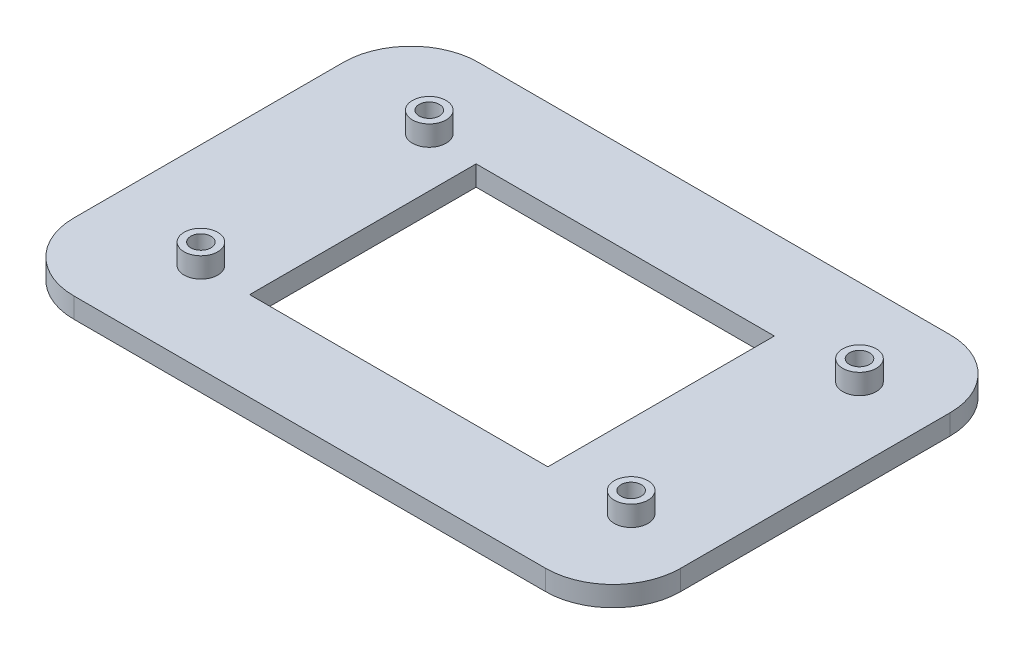
ISO-10303-21;
HEADER;
FILE_DESCRIPTION(('STEP AP214'),'2;1');
FILE_NAME('part.step','',(''),(''),'','','');
FILE_SCHEMA(('AUTOMOTIVE_DESIGN { 1 0 10303 214 1 1 1 1 }'));
ENDSEC;
DATA;
#1=APPLICATION_CONTEXT('core data for automotive mechanical design processes');
#2=APPLICATION_PROTOCOL_DEFINITION('international standard','automotive_design',2000,#1);
#3=PRODUCT_CONTEXT('',#1,'mechanical');
#4=PRODUCT('Part','Part','',(#3));
#5=PRODUCT_RELATED_PRODUCT_CATEGORY('part','',(#4));
#6=PRODUCT_DEFINITION_FORMATION('','',#4);
#7=PRODUCT_DEFINITION_CONTEXT('part definition',#1,'design');
#8=PRODUCT_DEFINITION('design','',#6,#7);
#9=PRODUCT_DEFINITION_SHAPE('','',#8);
#10=(LENGTH_UNIT() NAMED_UNIT(*) SI_UNIT(.MILLI.,.METRE.));
#11=(NAMED_UNIT(*) PLANE_ANGLE_UNIT() SI_UNIT($,.RADIAN.));
#12=(NAMED_UNIT(*) SI_UNIT($,.STERADIAN.) SOLID_ANGLE_UNIT());
#13=UNCERTAINTY_MEASURE_WITH_UNIT(LENGTH_MEASURE(1.E-05),#10,'distance_accuracy_value','');
#14=(GEOMETRIC_REPRESENTATION_CONTEXT(3) GLOBAL_UNCERTAINTY_ASSIGNED_CONTEXT((#13)) GLOBAL_UNIT_ASSIGNED_CONTEXT((#10,
#11,#12)) REPRESENTATION_CONTEXT('',''));
#15=CARTESIAN_POINT('',(0.,0.,0.));
#16=DIRECTION('',(0.,0.,1.));
#17=DIRECTION('',(1.,0.,0.));
#18=AXIS2_PLACEMENT_3D('',#15,#16,#17);
#19=CARTESIAN_POINT('',(-60.8536585365854,3.,-27.6829268292683));
#20=DIRECTION('',(1.,0.,0.));
#21=DIRECTION('',(0.,0.,-1.));
#22=AXIS2_PLACEMENT_3D('',#19,#20,#21);
#23=PLANE('',#22);
#24=DIRECTION('',(0.,0.,1.));
#25=VECTOR('',#24,1.);
#26=CARTESIAN_POINT('',(-60.8536585365854,0.,-27.6829268292683));
#27=LINE('',#26,#25);
#28=CARTESIAN_POINT('',(-60.8536585365854,0.,-17.6829268292683));
#29=VERTEX_POINT('',#28);
#30=CARTESIAN_POINT('',(-60.8536585365854,0.,22.3170731707317));
#31=VERTEX_POINT('',#30);
#32=EDGE_CURVE('E167',#29,#31,#27,.T.);
#33=ORIENTED_EDGE('',*,*,#32,.T.);
#34=DIRECTION('',(0.,-1.,0.));
#35=VECTOR('',#34,1.);
#36=CARTESIAN_POINT('',(-60.8536585365854,3.,22.3170731707317));
#37=LINE('',#36,#35);
#38=CARTESIAN_POINT('',(-60.8536585365854,3.,22.3170731707317));
#39=VERTEX_POINT('',#38);
#40=EDGE_CURVE('E11',#31,#39,#37,.F.);
#41=ORIENTED_EDGE('',*,*,#40,.T.);
#42=DIRECTION('',(0.,0.,1.));
#43=VECTOR('',#42,1.);
#44=CARTESIAN_POINT('',(-60.8536585365854,3.,-27.6829268292683));
#45=LINE('',#44,#43);
#46=CARTESIAN_POINT('',(-60.8536585365854,3.,-17.6829268292683));
#47=VERTEX_POINT('',#46);
#48=EDGE_CURVE('E171',#47,#39,#45,.T.);
#49=ORIENTED_EDGE('',*,*,#48,.F.);
#50=DIRECTION('',(0.,-1.,0.));
#51=VECTOR('',#50,1.);
#52=CARTESIAN_POINT('',(-60.8536585365854,3.,-17.6829268292683));
#53=LINE('',#52,#51);
#54=EDGE_CURVE('E41',#47,#29,#53,.T.);
#55=ORIENTED_EDGE('',*,*,#54,.T.);
#56=EDGE_LOOP('',(#33,#41,#49,#55));
#57=FACE_BOUND('',#56,.T.);
#58=ADVANCED_FACE('F33',(#57),#23,.F.);
#59=CARTESIAN_POINT('',(-60.8536585365854,3.,32.3170731707317));
#60=DIRECTION('',(0.,0.,-1.));
#61=DIRECTION('',(-1.,0.,0.));
#62=AXIS2_PLACEMENT_3D('',#59,#60,#61);
#63=PLANE('',#62);
#64=DIRECTION('',(1.,0.,0.));
#65=VECTOR('',#64,1.);
#66=CARTESIAN_POINT('',(-60.8536585365854,0.,32.3170731707317));
#67=LINE('',#66,#65);
#68=CARTESIAN_POINT('',(-50.8536585365854,0.,32.3170731707317));
#69=VERTEX_POINT('',#68);
#70=CARTESIAN_POINT('',(19.1463414634146,0.,32.3170731707317));
#71=VERTEX_POINT('',#70);
#72=EDGE_CURVE('E185',#69,#71,#67,.T.);
#73=ORIENTED_EDGE('',*,*,#72,.T.);
#74=DIRECTION('',(0.,-1.,0.));
#75=VECTOR('',#74,1.);
#76=CARTESIAN_POINT('',(19.1463414634146,3.,32.3170731707317));
#77=LINE('',#76,#75);
#78=CARTESIAN_POINT('',(19.1463414634146,3.,32.3170731707317));
#79=VERTEX_POINT('',#78);
#80=EDGE_CURVE('E48',#71,#79,#77,.F.);
#81=ORIENTED_EDGE('',*,*,#80,.T.);
#82=DIRECTION('',(1.,0.,0.));
#83=VECTOR('',#82,1.);
#84=CARTESIAN_POINT('',(-60.8536585365854,3.,32.3170731707317));
#85=LINE('',#84,#83);
#86=CARTESIAN_POINT('',(-50.8536585365854,3.,32.3170731707317));
#87=VERTEX_POINT('',#86);
#88=EDGE_CURVE('E173',#87,#79,#85,.T.);
#89=ORIENTED_EDGE('',*,*,#88,.F.);
#90=DIRECTION('',(0.,-1.,0.));
#91=VECTOR('',#90,1.);
#92=CARTESIAN_POINT('',(-50.8536585365854,3.,32.3170731707317));
#93=LINE('',#92,#91);
#94=EDGE_CURVE('E216',#87,#69,#93,.T.);
#95=ORIENTED_EDGE('',*,*,#94,.T.);
#96=EDGE_LOOP('',(#73,#81,#89,#95));
#97=FACE_BOUND('',#96,.T.);
#98=ADVANCED_FACE('F232',(#97),#63,.F.);
#99=CARTESIAN_POINT('',(29.1463414634146,3.,-27.6829268292683));
#100=DIRECTION('',(-1.,0.,0.));
#101=DIRECTION('',(0.,0.,1.));
#102=AXIS2_PLACEMENT_3D('',#99,#100,#101);
#103=PLANE('',#102);
#104=DIRECTION('',(0.,0.,-1.));
#105=VECTOR('',#104,1.);
#106=CARTESIAN_POINT('',(29.1463414634146,0.,-27.6829268292683));
#107=LINE('',#106,#105);
#108=CARTESIAN_POINT('',(29.1463414634146,0.,22.3170731707317));
#109=VERTEX_POINT('',#108);
#110=CARTESIAN_POINT('',(29.1463414634146,0.,-17.6829268292683));
#111=VERTEX_POINT('',#110);
#112=EDGE_CURVE('E187',#109,#111,#107,.T.);
#113=ORIENTED_EDGE('',*,*,#112,.T.);
#114=DIRECTION('',(0.,-1.,0.));
#115=VECTOR('',#114,1.);
#116=CARTESIAN_POINT('',(29.1463414634146,3.,-17.6829268292683));
#117=LINE('',#116,#115);
#118=CARTESIAN_POINT('',(29.1463414634146,3.,-17.6829268292683));
#119=VERTEX_POINT('',#118);
#120=EDGE_CURVE('E207',#111,#119,#117,.F.);
#121=ORIENTED_EDGE('',*,*,#120,.T.);
#122=DIRECTION('',(0.,0.,-1.));
#123=VECTOR('',#122,1.);
#124=CARTESIAN_POINT('',(29.1463414634146,3.,-27.6829268292683));
#125=LINE('',#124,#123);
#126=CARTESIAN_POINT('',(29.1463414634146,3.,22.3170731707317));
#127=VERTEX_POINT('',#126);
#128=EDGE_CURVE('E176',#127,#119,#125,.T.);
#129=ORIENTED_EDGE('',*,*,#128,.F.);
#130=DIRECTION('',(0.,-1.,0.));
#131=VECTOR('',#130,1.);
#132=CARTESIAN_POINT('',(29.1463414634146,3.,22.3170731707317));
#133=LINE('',#132,#131);
#134=EDGE_CURVE('E204',#127,#109,#133,.T.);
#135=ORIENTED_EDGE('',*,*,#134,.T.);
#136=EDGE_LOOP('',(#113,#121,#129,#135));
#137=FACE_BOUND('',#136,.T.);
#138=ADVANCED_FACE('F241',(#137),#103,.F.);
#139=CARTESIAN_POINT('',(-60.8536585365854,3.,-27.6829268292683));
#140=DIRECTION('',(0.,0.,1.));
#141=DIRECTION('',(1.,0.,0.));
#142=AXIS2_PLACEMENT_3D('',#139,#140,#141);
#143=PLANE('',#142);
#144=DIRECTION('',(-1.,0.,0.));
#145=VECTOR('',#144,1.);
#146=CARTESIAN_POINT('',(-60.8536585365854,3.,-27.6829268292683));
#147=LINE('',#146,#145);
#148=CARTESIAN_POINT('',(19.1463414634146,3.,-27.6829268292683));
#149=VERTEX_POINT('',#148);
#150=CARTESIAN_POINT('',(-50.8536585365854,3.,-27.6829268292683));
#151=VERTEX_POINT('',#150);
#152=EDGE_CURVE('E179',#149,#151,#147,.T.);
#153=ORIENTED_EDGE('',*,*,#152,.F.);
#154=DIRECTION('',(0.,-1.,0.));
#155=VECTOR('',#154,1.);
#156=CARTESIAN_POINT('',(19.1463414634146,3.,-27.6829268292683));
#157=LINE('',#156,#155);
#158=CARTESIAN_POINT('',(19.1463414634146,0.,-27.6829268292683));
#159=VERTEX_POINT('',#158);
#160=EDGE_CURVE('E193',#149,#159,#157,.T.);
#161=ORIENTED_EDGE('',*,*,#160,.T.);
#162=DIRECTION('',(-1.,0.,0.));
#163=VECTOR('',#162,1.);
#164=CARTESIAN_POINT('',(-60.8536585365854,0.,-27.6829268292683));
#165=LINE('',#164,#163);
#166=CARTESIAN_POINT('',(-50.8536585365854,0.,-27.6829268292683));
#167=VERTEX_POINT('',#166);
#168=EDGE_CURVE('E174',#159,#167,#165,.T.);
#169=ORIENTED_EDGE('',*,*,#168,.T.);
#170=DIRECTION('',(0.,-1.,0.));
#171=VECTOR('',#170,1.);
#172=CARTESIAN_POINT('',(-50.8536585365854,3.,-27.6829268292683));
#173=LINE('',#172,#171);
#174=EDGE_CURVE('E182',#167,#151,#173,.F.);
#175=ORIENTED_EDGE('',*,*,#174,.T.);
#176=EDGE_LOOP('',(#153,#161,#169,#175));
#177=FACE_BOUND('',#176,.T.);
#178=ADVANCED_FACE('F249',(#177),#143,.F.);
#179=CARTESIAN_POINT('',(0.,3.,0.));
#180=DIRECTION('',(0.,1.,0.));
#181=DIRECTION('',(0.,0.,1.));
#182=AXIS2_PLACEMENT_3D('',#179,#180,#181);
#183=PLANE('',#182);
#184=CARTESIAN_POINT('',(18.4713414634146,3.,-14.8979268292683));
#185=DIRECTION('',(0.,1.,0.));
#186=DIRECTION('',(0.,0.,1.));
#187=AXIS2_PLACEMENT_3D('',#184,#185,#186);
#188=CIRCLE('',#187,2.5);
#189=CARTESIAN_POINT('',(18.4713414634146,3.,-12.3979268292683));
#190=VERTEX_POINT('',#189);
#191=EDGE_CURVE('E538',#190,#190,#188,.T.);
#192=ORIENTED_EDGE('',*,*,#191,.F.);
#193=EDGE_LOOP('',(#192));
#194=FACE_BOUND('',#193,.T.);
#195=CARTESIAN_POINT('',(18.4713414634146,3.,18.9720731707317));
#196=DIRECTION('',(0.,1.,0.));
#197=DIRECTION('',(0.,0.,1.));
#198=AXIS2_PLACEMENT_3D('',#195,#196,#197);
#199=CIRCLE('',#198,2.5);
#200=CARTESIAN_POINT('',(18.4713414634146,3.,21.4720731707317));
#201=VERTEX_POINT('',#200);
#202=EDGE_CURVE('E532',#201,#201,#199,.T.);
#203=ORIENTED_EDGE('',*,*,#202,.F.);
#204=EDGE_LOOP('',(#203));
#205=FACE_BOUND('',#204,.T.);
#206=CARTESIAN_POINT('',(-45.3386585365854,3.,18.9720731707317));
#207=DIRECTION('',(0.,1.,0.));
#208=DIRECTION('',(0.,0.,1.));
#209=AXIS2_PLACEMENT_3D('',#206,#207,#208);
#210=CIRCLE('',#209,2.5);
#211=CARTESIAN_POINT('',(-45.3386585365854,3.,21.4720731707317));
#212=VERTEX_POINT('',#211);
#213=EDGE_CURVE('E526',#212,#212,#210,.T.);
#214=ORIENTED_EDGE('',*,*,#213,.F.);
#215=EDGE_LOOP('',(#214));
#216=FACE_BOUND('',#215,.T.);
#217=CARTESIAN_POINT('',(-45.3386585365854,3.,-14.8979268292683));
#218=DIRECTION('',(0.,1.,0.));
#219=DIRECTION('',(0.,0.,1.));
#220=AXIS2_PLACEMENT_3D('',#217,#218,#219);
#221=CIRCLE('',#220,2.5);
#222=CARTESIAN_POINT('',(-45.3386585365854,3.,-12.3979268292683));
#223=VERTEX_POINT('',#222);
#224=EDGE_CURVE('E517',#223,#223,#221,.T.);
#225=ORIENTED_EDGE('',*,*,#224,.F.);
#226=EDGE_LOOP('',(#225));
#227=FACE_BOUND('',#226,.T.);
#228=DIRECTION('',(0.,0.,1.));
#229=VECTOR('',#228,1.);
#230=CARTESIAN_POINT('',(-37.9686585365854,3.,-14.4779268292683));
#231=LINE('',#230,#229);
#232=CARTESIAN_POINT('',(-37.9686585365854,3.,-14.4779268292683));
#233=VERTEX_POINT('',#232);
#234=CARTESIAN_POINT('',(-37.9686585365854,3.,19.1120731707317));
#235=VERTEX_POINT('',#234);
#236=EDGE_CURVE('E130',#233,#235,#231,.T.);
#237=ORIENTED_EDGE('',*,*,#236,.F.);
#238=DIRECTION('',(-1.,0.,0.));
#239=VECTOR('',#238,1.);
#240=CARTESIAN_POINT('',(-37.9686585365854,3.,-14.4779268292683));
#241=LINE('',#240,#239);
#242=CARTESIAN_POINT('',(6.26134146341462,3.,-14.4779268292683));
#243=VERTEX_POINT('',#242);
#244=EDGE_CURVE('E148',#243,#233,#241,.T.);
#245=ORIENTED_EDGE('',*,*,#244,.F.);
#246=DIRECTION('',(0.,0.,-1.));
#247=VECTOR('',#246,1.);
#248=CARTESIAN_POINT('',(6.26134146341462,3.,-14.4779268292683));
#249=LINE('',#248,#247);
#250=CARTESIAN_POINT('',(6.26134146341463,3.,19.1120731707317));
#251=VERTEX_POINT('',#250);
#252=EDGE_CURVE('E151',#251,#243,#249,.T.);
#253=ORIENTED_EDGE('',*,*,#252,.F.);
#254=DIRECTION('',(1.,0.,0.));
#255=VECTOR('',#254,1.);
#256=CARTESIAN_POINT('',(-37.9686585365854,3.,19.1120731707317));
#257=LINE('',#256,#255);
#258=EDGE_CURVE('E160',#235,#251,#257,.T.);
#259=ORIENTED_EDGE('',*,*,#258,.F.);
#260=EDGE_LOOP('',(#237,#245,#253,#259));
#261=FACE_BOUND('',#260,.T.);
#262=ORIENTED_EDGE('',*,*,#128,.T.);
#263=CARTESIAN_POINT('',(19.1463414634146,3.,-17.6829268292683));
#264=DIRECTION('',(0.,1.,0.));
#265=DIRECTION('',(0.,0.,1.));
#266=AXIS2_PLACEMENT_3D('',#263,#264,#265);
#267=CIRCLE('',#266,10.);
#268=EDGE_CURVE('E214',#119,#149,#267,.T.);
#269=ORIENTED_EDGE('',*,*,#268,.T.);
#270=ORIENTED_EDGE('',*,*,#152,.T.);
#271=CARTESIAN_POINT('',(-50.8536585365854,3.,-17.6829268292683));
#272=DIRECTION('',(0.,1.,0.));
#273=DIRECTION('',(0.,0.,1.));
#274=AXIS2_PLACEMENT_3D('',#271,#272,#273);
#275=CIRCLE('',#274,10.);
#276=EDGE_CURVE('E209',#151,#47,#275,.T.);
#277=ORIENTED_EDGE('',*,*,#276,.T.);
#278=ORIENTED_EDGE('',*,*,#48,.T.);
#279=CARTESIAN_POINT('',(-50.8536585365854,3.,22.3170731707317));
#280=DIRECTION('',(0.,1.,0.));
#281=DIRECTION('',(0.,0.,1.));
#282=AXIS2_PLACEMENT_3D('',#279,#280,#281);
#283=CIRCLE('',#282,10.);
#284=EDGE_CURVE('E55',#39,#87,#283,.T.);
#285=ORIENTED_EDGE('',*,*,#284,.T.);
#286=ORIENTED_EDGE('',*,*,#88,.T.);
#287=CARTESIAN_POINT('',(19.1463414634146,3.,22.3170731707317));
#288=DIRECTION('',(0.,1.,0.));
#289=DIRECTION('',(0.,0.,1.));
#290=AXIS2_PLACEMENT_3D('',#287,#288,#289);
#291=CIRCLE('',#290,10.);
#292=EDGE_CURVE('E212',#79,#127,#291,.T.);
#293=ORIENTED_EDGE('',*,*,#292,.T.);
#294=EDGE_LOOP('',(#262,#269,#270,#277,#278,#285,#286,#293));
#295=FACE_BOUND('',#294,.T.);
#296=ADVANCED_FACE('F234',(#194,#205,#216,#227,#261,#295),#183,.T.);
#297=CARTESIAN_POINT('',(0.,0.,0.));
#298=DIRECTION('',(0.,1.,0.));
#299=DIRECTION('',(0.,0.,1.));
#300=AXIS2_PLACEMENT_3D('',#297,#298,#299);
#301=PLANE('',#300);
#302=CARTESIAN_POINT('',(18.4713414634146,0.,18.9720731707317));
#303=DIRECTION('',(0.,1.,0.));
#304=DIRECTION('',(0.,0.,1.));
#305=AXIS2_PLACEMENT_3D('',#302,#303,#304);
#306=CIRCLE('',#305,1.5);
#307=CARTESIAN_POINT('',(18.4713414634146,0.,20.4720731707317));
#308=VERTEX_POINT('',#307);
#309=EDGE_CURVE('E154',#308,#308,#306,.T.);
#310=ORIENTED_EDGE('',*,*,#309,.T.);
#311=EDGE_LOOP('',(#310));
#312=FACE_BOUND('',#311,.T.);
#313=CARTESIAN_POINT('',(18.4713414634146,0.,-14.8979268292683));
#314=DIRECTION('',(0.,1.,0.));
#315=DIRECTION('',(0.,0.,1.));
#316=AXIS2_PLACEMENT_3D('',#313,#314,#315);
#317=CIRCLE('',#316,1.5);
#318=CARTESIAN_POINT('',(18.4713414634146,0.,-13.3979268292683));
#319=VERTEX_POINT('',#318);
#320=EDGE_CURVE('E507',#319,#319,#317,.T.);
#321=ORIENTED_EDGE('',*,*,#320,.T.);
#322=EDGE_LOOP('',(#321));
#323=FACE_BOUND('',#322,.T.);
#324=CARTESIAN_POINT('',(-45.3386585365854,0.,18.9720731707317));
#325=DIRECTION('',(0.,1.,0.));
#326=DIRECTION('',(0.,0.,1.));
#327=AXIS2_PLACEMENT_3D('',#324,#325,#326);
#328=CIRCLE('',#327,1.5);
#329=CARTESIAN_POINT('',(-45.3386585365854,0.,20.4720731707317));
#330=VERTEX_POINT('',#329);
#331=EDGE_CURVE('E511',#330,#330,#328,.T.);
#332=ORIENTED_EDGE('',*,*,#331,.T.);
#333=EDGE_LOOP('',(#332));
#334=FACE_BOUND('',#333,.T.);
#335=CARTESIAN_POINT('',(-45.3386585365854,0.,-14.8979268292683));
#336=DIRECTION('',(0.,1.,0.));
#337=DIRECTION('',(0.,0.,1.));
#338=AXIS2_PLACEMENT_3D('',#335,#336,#337);
#339=CIRCLE('',#338,1.5);
#340=CARTESIAN_POINT('',(-45.3386585365854,0.,-13.3979268292683));
#341=VERTEX_POINT('',#340);
#342=EDGE_CURVE('E161',#341,#341,#339,.T.);
#343=ORIENTED_EDGE('',*,*,#342,.T.);
#344=EDGE_LOOP('',(#343));
#345=FACE_BOUND('',#344,.T.);
#346=DIRECTION('',(-1.,0.,0.));
#347=VECTOR('',#346,1.);
#348=CARTESIAN_POINT('',(-37.9686585365854,0.,-14.4779268292683));
#349=LINE('',#348,#347);
#350=CARTESIAN_POINT('',(6.26134146341462,0.,-14.4779268292683));
#351=VERTEX_POINT('',#350);
#352=CARTESIAN_POINT('',(-37.9686585365854,0.,-14.4779268292683));
#353=VERTEX_POINT('',#352);
#354=EDGE_CURVE('E135',#351,#353,#349,.T.);
#355=ORIENTED_EDGE('',*,*,#354,.T.);
#356=DIRECTION('',(0.,0.,1.));
#357=VECTOR('',#356,1.);
#358=CARTESIAN_POINT('',(-37.9686585365854,0.,-14.4779268292683));
#359=LINE('',#358,#357);
#360=CARTESIAN_POINT('',(-37.9686585365854,0.,19.1120731707317));
#361=VERTEX_POINT('',#360);
#362=EDGE_CURVE('E127',#353,#361,#359,.T.);
#363=ORIENTED_EDGE('',*,*,#362,.T.);
#364=DIRECTION('',(1.,0.,0.));
#365=VECTOR('',#364,1.);
#366=CARTESIAN_POINT('',(-37.9686585365854,0.,19.1120731707317));
#367=LINE('',#366,#365);
#368=CARTESIAN_POINT('',(6.26134146341463,0.,19.1120731707317));
#369=VERTEX_POINT('',#368);
#370=EDGE_CURVE('E139',#361,#369,#367,.T.);
#371=ORIENTED_EDGE('',*,*,#370,.T.);
#372=DIRECTION('',(0.,0.,-1.));
#373=VECTOR('',#372,1.);
#374=CARTESIAN_POINT('',(6.26134146341462,0.,-14.4779268292683));
#375=LINE('',#374,#373);
#376=EDGE_CURVE('E143',#369,#351,#375,.T.);
#377=ORIENTED_EDGE('',*,*,#376,.T.);
#378=EDGE_LOOP('',(#355,#363,#371,#377));
#379=FACE_BOUND('',#378,.T.);
#380=ORIENTED_EDGE('',*,*,#168,.F.);
#381=CARTESIAN_POINT('',(19.1463414634146,0.,-17.6829268292683));
#382=DIRECTION('',(0.,1.,0.));
#383=DIRECTION('',(0.,0.,1.));
#384=AXIS2_PLACEMENT_3D('',#381,#382,#383);
#385=CIRCLE('',#384,10.);
#386=EDGE_CURVE('E202',#159,#111,#385,.F.);
#387=ORIENTED_EDGE('',*,*,#386,.T.);
#388=ORIENTED_EDGE('',*,*,#112,.F.);
#389=CARTESIAN_POINT('',(19.1463414634146,0.,22.3170731707317));
#390=DIRECTION('',(0.,1.,0.));
#391=DIRECTION('',(0.,0.,1.));
#392=AXIS2_PLACEMENT_3D('',#389,#390,#391);
#393=CIRCLE('',#392,10.);
#394=EDGE_CURVE('E200',#109,#71,#393,.F.);
#395=ORIENTED_EDGE('',*,*,#394,.T.);
#396=ORIENTED_EDGE('',*,*,#72,.F.);
#397=CARTESIAN_POINT('',(-50.8536585365854,0.,22.3170731707317));
#398=DIRECTION('',(0.,1.,0.));
#399=DIRECTION('',(0.,0.,1.));
#400=AXIS2_PLACEMENT_3D('',#397,#398,#399);
#401=CIRCLE('',#400,10.);
#402=EDGE_CURVE('E198',#69,#31,#401,.F.);
#403=ORIENTED_EDGE('',*,*,#402,.T.);
#404=ORIENTED_EDGE('',*,*,#32,.F.);
#405=CARTESIAN_POINT('',(-50.8536585365854,0.,-17.6829268292683));
#406=DIRECTION('',(0.,1.,0.));
#407=DIRECTION('',(0.,0.,1.));
#408=AXIS2_PLACEMENT_3D('',#405,#406,#407);
#409=CIRCLE('',#408,10.);
#410=EDGE_CURVE('E196',#29,#167,#409,.F.);
#411=ORIENTED_EDGE('',*,*,#410,.T.);
#412=EDGE_LOOP('',(#380,#387,#388,#395,#396,#403,#404,#411));
#413=FACE_BOUND('',#412,.T.);
#414=ADVANCED_FACE('F145',(#312,#323,#334,#345,#379,#413),#301,.F.);
#415=CARTESIAN_POINT('',(-37.9686585365854,0.,-14.4779268292683));
#416=DIRECTION('',(-1.,0.,0.));
#417=DIRECTION('',(0.,0.,1.));
#418=AXIS2_PLACEMENT_3D('',#415,#416,#417);
#419=PLANE('',#418);
#420=ORIENTED_EDGE('',*,*,#236,.T.);
#421=DIRECTION('',(0.,1.,0.));
#422=VECTOR('',#421,1.);
#423=CARTESIAN_POINT('',(-37.9686585365854,0.,19.1120731707317));
#424=LINE('',#423,#422);
#425=EDGE_CURVE('E123',#361,#235,#424,.T.);
#426=ORIENTED_EDGE('',*,*,#425,.F.);
#427=ORIENTED_EDGE('',*,*,#362,.F.);
#428=DIRECTION('',(0.,1.,0.));
#429=VECTOR('',#428,1.);
#430=CARTESIAN_POINT('',(-37.9686585365854,0.,-14.4779268292683));
#431=LINE('',#430,#429);
#432=EDGE_CURVE('E165',#353,#233,#431,.T.);
#433=ORIENTED_EDGE('',*,*,#432,.T.);
#434=EDGE_LOOP('',(#420,#426,#427,#433));
#435=FACE_BOUND('',#434,.T.);
#436=ADVANCED_FACE('F125',(#435),#419,.F.);
#437=CARTESIAN_POINT('',(-37.9686585365854,0.,-14.4779268292683));
#438=DIRECTION('',(0.,0.,-1.));
#439=DIRECTION('',(-1.,0.,0.));
#440=AXIS2_PLACEMENT_3D('',#437,#438,#439);
#441=PLANE('',#440);
#442=ORIENTED_EDGE('',*,*,#244,.T.);
#443=ORIENTED_EDGE('',*,*,#432,.F.);
#444=ORIENTED_EDGE('',*,*,#354,.F.);
#445=DIRECTION('',(0.,1.,0.));
#446=VECTOR('',#445,1.);
#447=CARTESIAN_POINT('',(6.26134146341462,0.,-14.4779268292683));
#448=LINE('',#447,#446);
#449=EDGE_CURVE('E168',#351,#243,#448,.T.);
#450=ORIENTED_EDGE('',*,*,#449,.T.);
#451=EDGE_LOOP('',(#442,#443,#444,#450));
#452=FACE_BOUND('',#451,.T.);
#453=ADVANCED_FACE('F423',(#452),#441,.F.);
#454=CARTESIAN_POINT('',(6.26134146341462,0.,-14.4779268292683));
#455=DIRECTION('',(1.,0.,0.));
#456=DIRECTION('',(0.,0.,-1.));
#457=AXIS2_PLACEMENT_3D('',#454,#455,#456);
#458=PLANE('',#457);
#459=ORIENTED_EDGE('',*,*,#252,.T.);
#460=ORIENTED_EDGE('',*,*,#449,.F.);
#461=ORIENTED_EDGE('',*,*,#376,.F.);
#462=DIRECTION('',(0.,1.,0.));
#463=VECTOR('',#462,1.);
#464=CARTESIAN_POINT('',(6.26134146341463,0.,19.1120731707317));
#465=LINE('',#464,#463);
#466=EDGE_CURVE('E134',#369,#251,#465,.T.);
#467=ORIENTED_EDGE('',*,*,#466,.T.);
#468=EDGE_LOOP('',(#459,#460,#461,#467));
#469=FACE_BOUND('',#468,.T.);
#470=ADVANCED_FACE('F426',(#469),#458,.F.);
#471=CARTESIAN_POINT('',(-37.9686585365854,0.,19.1120731707317));
#472=DIRECTION('',(0.,0.,1.));
#473=DIRECTION('',(1.,0.,0.));
#474=AXIS2_PLACEMENT_3D('',#471,#472,#473);
#475=PLANE('',#474);
#476=ORIENTED_EDGE('',*,*,#258,.T.);
#477=ORIENTED_EDGE('',*,*,#466,.F.);
#478=ORIENTED_EDGE('',*,*,#370,.F.);
#479=ORIENTED_EDGE('',*,*,#425,.T.);
#480=EDGE_LOOP('',(#476,#477,#478,#479));
#481=FACE_BOUND('',#480,.T.);
#482=ADVANCED_FACE('F140',(#481),#475,.F.);
#483=CARTESIAN_POINT('',(-45.3386585365854,0.,-14.8979268292683));
#484=DIRECTION('',(0.,1.,0.));
#485=DIRECTION('',(0.,0.,1.));
#486=AXIS2_PLACEMENT_3D('',#483,#484,#485);
#487=CYLINDRICAL_SURFACE('',#486,1.5);
#488=ORIENTED_EDGE('',*,*,#342,.F.);
#489=EDGE_LOOP('',(#488));
#490=FACE_BOUND('',#489,.T.);
#491=CARTESIAN_POINT('',(-45.3386585365854,6.,-14.8979268292683));
#492=DIRECTION('',(0.,1.,0.));
#493=DIRECTION('',(0.,0.,1.));
#494=AXIS2_PLACEMENT_3D('',#491,#492,#493);
#495=CIRCLE('',#494,1.5);
#496=CARTESIAN_POINT('',(-45.3386585365854,6.,-13.3979268292683));
#497=VERTEX_POINT('',#496);
#498=EDGE_CURVE('E541',#497,#497,#495,.T.);
#499=ORIENTED_EDGE('',*,*,#498,.T.);
#500=EDGE_LOOP('',(#499));
#501=FACE_BOUND('',#500,.T.);
#502=ADVANCED_FACE('F350',(#490,#501),#487,.F.);
#503=CARTESIAN_POINT('',(-45.3386585365854,0.,18.9720731707317));
#504=DIRECTION('',(0.,1.,0.));
#505=DIRECTION('',(0.,0.,1.));
#506=AXIS2_PLACEMENT_3D('',#503,#504,#505);
#507=CYLINDRICAL_SURFACE('',#506,1.5);
#508=ORIENTED_EDGE('',*,*,#331,.F.);
#509=EDGE_LOOP('',(#508));
#510=FACE_BOUND('',#509,.T.);
#511=CARTESIAN_POINT('',(-45.3386585365854,6.,18.9720731707317));
#512=DIRECTION('',(0.,1.,0.));
#513=DIRECTION('',(0.,0.,1.));
#514=AXIS2_PLACEMENT_3D('',#511,#512,#513);
#515=CIRCLE('',#514,1.5);
#516=CARTESIAN_POINT('',(-45.3386585365854,6.,20.4720731707317));
#517=VERTEX_POINT('',#516);
#518=EDGE_CURVE('E546',#517,#517,#515,.T.);
#519=ORIENTED_EDGE('',*,*,#518,.T.);
#520=EDGE_LOOP('',(#519));
#521=FACE_BOUND('',#520,.T.);
#522=ADVANCED_FACE('F355',(#510,#521),#507,.F.);
#523=CARTESIAN_POINT('',(18.4713414634146,0.,-14.8979268292683));
#524=DIRECTION('',(0.,1.,0.));
#525=DIRECTION('',(0.,0.,1.));
#526=AXIS2_PLACEMENT_3D('',#523,#524,#525);
#527=CYLINDRICAL_SURFACE('',#526,1.5);
#528=ORIENTED_EDGE('',*,*,#320,.F.);
#529=EDGE_LOOP('',(#528));
#530=FACE_BOUND('',#529,.T.);
#531=CARTESIAN_POINT('',(18.4713414634146,6.,-14.8979268292683));
#532=DIRECTION('',(0.,1.,0.));
#533=DIRECTION('',(0.,0.,1.));
#534=AXIS2_PLACEMENT_3D('',#531,#532,#533);
#535=CIRCLE('',#534,1.5);
#536=CARTESIAN_POINT('',(18.4713414634146,6.,-13.3979268292683));
#537=VERTEX_POINT('',#536);
#538=EDGE_CURVE('E547',#537,#537,#535,.T.);
#539=ORIENTED_EDGE('',*,*,#538,.T.);
#540=EDGE_LOOP('',(#539));
#541=FACE_BOUND('',#540,.T.);
#542=ADVANCED_FACE('F367',(#530,#541),#527,.F.);
#543=CARTESIAN_POINT('',(18.4713414634146,0.,18.9720731707317));
#544=DIRECTION('',(0.,1.,0.));
#545=DIRECTION('',(0.,0.,1.));
#546=AXIS2_PLACEMENT_3D('',#543,#544,#545);
#547=CYLINDRICAL_SURFACE('',#546,1.5);
#548=ORIENTED_EDGE('',*,*,#309,.F.);
#549=EDGE_LOOP('',(#548));
#550=FACE_BOUND('',#549,.T.);
#551=CARTESIAN_POINT('',(18.4713414634146,6.,18.9720731707317));
#552=DIRECTION('',(0.,1.,0.));
#553=DIRECTION('',(0.,0.,1.));
#554=AXIS2_PLACEMENT_3D('',#551,#552,#553);
#555=CIRCLE('',#554,1.5);
#556=CARTESIAN_POINT('',(18.4713414634146,6.,20.4720731707317));
#557=VERTEX_POINT('',#556);
#558=EDGE_CURVE('E550',#557,#557,#555,.T.);
#559=ORIENTED_EDGE('',*,*,#558,.T.);
#560=EDGE_LOOP('',(#559));
#561=FACE_BOUND('',#560,.T.);
#562=ADVANCED_FACE('F270',(#550,#561),#547,.F.);
#563=CARTESIAN_POINT('',(19.1463414634146,3.,-17.6829268292683));
#564=DIRECTION('',(0.,-1.,0.));
#565=DIRECTION('',(0.,0.,-1.));
#566=AXIS2_PLACEMENT_3D('',#563,#564,#565);
#567=CYLINDRICAL_SURFACE('',#566,10.);
#568=ORIENTED_EDGE('',*,*,#268,.F.);
#569=ORIENTED_EDGE('',*,*,#120,.F.);
#570=ORIENTED_EDGE('',*,*,#386,.F.);
#571=ORIENTED_EDGE('',*,*,#160,.F.);
#572=EDGE_LOOP('',(#568,#569,#570,#571));
#573=FACE_BOUND('',#572,.T.);
#574=ADVANCED_FACE('F246',(#573),#567,.T.);
#575=CARTESIAN_POINT('',(19.1463414634146,3.,22.3170731707317));
#576=DIRECTION('',(0.,-1.,0.));
#577=DIRECTION('',(0.,0.,-1.));
#578=AXIS2_PLACEMENT_3D('',#575,#576,#577);
#579=CYLINDRICAL_SURFACE('',#578,10.);
#580=ORIENTED_EDGE('',*,*,#292,.F.);
#581=ORIENTED_EDGE('',*,*,#80,.F.);
#582=ORIENTED_EDGE('',*,*,#394,.F.);
#583=ORIENTED_EDGE('',*,*,#134,.F.);
#584=EDGE_LOOP('',(#580,#581,#582,#583));
#585=FACE_BOUND('',#584,.T.);
#586=ADVANCED_FACE('F238',(#585),#579,.T.);
#587=CARTESIAN_POINT('',(-50.8536585365854,3.,22.3170731707317));
#588=DIRECTION('',(0.,-1.,0.));
#589=DIRECTION('',(0.,0.,-1.));
#590=AXIS2_PLACEMENT_3D('',#587,#588,#589);
#591=CYLINDRICAL_SURFACE('',#590,10.);
#592=ORIENTED_EDGE('',*,*,#284,.F.);
#593=ORIENTED_EDGE('',*,*,#40,.F.);
#594=ORIENTED_EDGE('',*,*,#402,.F.);
#595=ORIENTED_EDGE('',*,*,#94,.F.);
#596=EDGE_LOOP('',(#592,#593,#594,#595));
#597=FACE_BOUND('',#596,.T.);
#598=ADVANCED_FACE('F231',(#597),#591,.T.);
#599=CARTESIAN_POINT('',(-50.8536585365854,3.,-17.6829268292683));
#600=DIRECTION('',(0.,-1.,0.));
#601=DIRECTION('',(0.,0.,-1.));
#602=AXIS2_PLACEMENT_3D('',#599,#600,#601);
#603=CYLINDRICAL_SURFACE('',#602,10.);
#604=ORIENTED_EDGE('',*,*,#276,.F.);
#605=ORIENTED_EDGE('',*,*,#174,.F.);
#606=ORIENTED_EDGE('',*,*,#410,.F.);
#607=ORIENTED_EDGE('',*,*,#54,.F.);
#608=EDGE_LOOP('',(#604,#605,#606,#607));
#609=FACE_BOUND('',#608,.T.);
#610=ADVANCED_FACE('F35',(#609),#603,.T.);
#611=CARTESIAN_POINT('',(-45.3386585365854,6.,-14.8979268292683));
#612=DIRECTION('',(0.,-1.,0.));
#613=DIRECTION('',(0.,0.,-1.));
#614=AXIS2_PLACEMENT_3D('',#611,#612,#613);
#615=CYLINDRICAL_SURFACE('',#614,2.5);
#616=CARTESIAN_POINT('',(-45.3386585365854,6.,-14.8979268292683));
#617=DIRECTION('',(0.,1.,0.));
#618=DIRECTION('',(0.,0.,1.));
#619=AXIS2_PLACEMENT_3D('',#616,#617,#618);
#620=CIRCLE('',#619,2.5);
#621=CARTESIAN_POINT('',(-45.3386585365854,6.,-12.3979268292683));
#622=VERTEX_POINT('',#621);
#623=EDGE_CURVE('E519',#622,#622,#620,.T.);
#624=ORIENTED_EDGE('',*,*,#623,.F.);
#625=EDGE_LOOP('',(#624));
#626=FACE_BOUND('',#625,.T.);
#627=ORIENTED_EDGE('',*,*,#224,.T.);
#628=EDGE_LOOP('',(#627));
#629=FACE_BOUND('',#628,.T.);
#630=ADVANCED_FACE('F252',(#626,#629),#615,.T.);
#631=CARTESIAN_POINT('',(-45.3386585365854,6.,-14.8979268292683));
#632=DIRECTION('',(0.,1.,0.));
#633=DIRECTION('',(0.,0.,1.));
#634=AXIS2_PLACEMENT_3D('',#631,#632,#633);
#635=PLANE('',#634);
#636=ORIENTED_EDGE('',*,*,#498,.F.);
#637=EDGE_LOOP('',(#636));
#638=FACE_BOUND('',#637,.T.);
#639=ORIENTED_EDGE('',*,*,#623,.T.);
#640=EDGE_LOOP('',(#639));
#641=FACE_BOUND('',#640,.T.);
#642=ADVANCED_FACE('F257',(#638,#641),#635,.T.);
#643=CARTESIAN_POINT('',(-45.3386585365854,6.,18.9720731707317));
#644=DIRECTION('',(0.,-1.,0.));
#645=DIRECTION('',(0.,0.,-1.));
#646=AXIS2_PLACEMENT_3D('',#643,#644,#645);
#647=CYLINDRICAL_SURFACE('',#646,2.5);
#648=CARTESIAN_POINT('',(-45.3386585365854,6.,18.9720731707317));
#649=DIRECTION('',(0.,1.,0.));
#650=DIRECTION('',(0.,0.,1.));
#651=AXIS2_PLACEMENT_3D('',#648,#649,#650);
#652=CIRCLE('',#651,2.5);
#653=CARTESIAN_POINT('',(-45.3386585365854,6.,21.4720731707317));
#654=VERTEX_POINT('',#653);
#655=EDGE_CURVE('E524',#654,#654,#652,.T.);
#656=ORIENTED_EDGE('',*,*,#655,.F.);
#657=EDGE_LOOP('',(#656));
#658=FACE_BOUND('',#657,.T.);
#659=ORIENTED_EDGE('',*,*,#213,.T.);
#660=EDGE_LOOP('',(#659));
#661=FACE_BOUND('',#660,.T.);
#662=ADVANCED_FACE('F311',(#658,#661),#647,.T.);
#663=CARTESIAN_POINT('',(-45.3386585365854,6.,18.9720731707317));
#664=DIRECTION('',(0.,1.,0.));
#665=DIRECTION('',(0.,0.,1.));
#666=AXIS2_PLACEMENT_3D('',#663,#664,#665);
#667=PLANE('',#666);
#668=ORIENTED_EDGE('',*,*,#518,.F.);
#669=EDGE_LOOP('',(#668));
#670=FACE_BOUND('',#669,.T.);
#671=ORIENTED_EDGE('',*,*,#655,.T.);
#672=EDGE_LOOP('',(#671));
#673=FACE_BOUND('',#672,.T.);
#674=ADVANCED_FACE('F316',(#670,#673),#667,.T.);
#675=CARTESIAN_POINT('',(18.4713414634146,6.,18.9720731707317));
#676=DIRECTION('',(0.,-1.,0.));
#677=DIRECTION('',(0.,0.,-1.));
#678=AXIS2_PLACEMENT_3D('',#675,#676,#677);
#679=CYLINDRICAL_SURFACE('',#678,2.5);
#680=CARTESIAN_POINT('',(18.4713414634146,6.,18.9720731707317));
#681=DIRECTION('',(0.,1.,0.));
#682=DIRECTION('',(0.,0.,1.));
#683=AXIS2_PLACEMENT_3D('',#680,#681,#682);
#684=CIRCLE('',#683,2.5);
#685=CARTESIAN_POINT('',(18.4713414634146,6.,21.4720731707317));
#686=VERTEX_POINT('',#685);
#687=EDGE_CURVE('E529',#686,#686,#684,.T.);
#688=ORIENTED_EDGE('',*,*,#687,.F.);
#689=EDGE_LOOP('',(#688));
#690=FACE_BOUND('',#689,.T.);
#691=ORIENTED_EDGE('',*,*,#202,.T.);
#692=EDGE_LOOP('',(#691));
#693=FACE_BOUND('',#692,.T.);
#694=ADVANCED_FACE('F324',(#690,#693),#679,.T.);
#695=CARTESIAN_POINT('',(18.4713414634146,6.,18.9720731707317));
#696=DIRECTION('',(0.,1.,0.));
#697=DIRECTION('',(0.,0.,1.));
#698=AXIS2_PLACEMENT_3D('',#695,#696,#697);
#699=PLANE('',#698);
#700=ORIENTED_EDGE('',*,*,#558,.F.);
#701=EDGE_LOOP('',(#700));
#702=FACE_BOUND('',#701,.T.);
#703=ORIENTED_EDGE('',*,*,#687,.T.);
#704=EDGE_LOOP('',(#703));
#705=FACE_BOUND('',#704,.T.);
#706=ADVANCED_FACE('F329',(#702,#705),#699,.T.);
#707=CARTESIAN_POINT('',(18.4713414634146,6.,-14.8979268292683));
#708=DIRECTION('',(0.,-1.,0.));
#709=DIRECTION('',(0.,0.,-1.));
#710=AXIS2_PLACEMENT_3D('',#707,#708,#709);
#711=CYLINDRICAL_SURFACE('',#710,2.5);
#712=CARTESIAN_POINT('',(18.4713414634146,6.,-14.8979268292683));
#713=DIRECTION('',(0.,1.,0.));
#714=DIRECTION('',(0.,0.,1.));
#715=AXIS2_PLACEMENT_3D('',#712,#713,#714);
#716=CIRCLE('',#715,2.5);
#717=CARTESIAN_POINT('',(18.4713414634146,6.,-12.3979268292683));
#718=VERTEX_POINT('',#717);
#719=EDGE_CURVE('E535',#718,#718,#716,.T.);
#720=ORIENTED_EDGE('',*,*,#719,.F.);
#721=EDGE_LOOP('',(#720));
#722=FACE_BOUND('',#721,.T.);
#723=ORIENTED_EDGE('',*,*,#191,.T.);
#724=EDGE_LOOP('',(#723));
#725=FACE_BOUND('',#724,.T.);
#726=ADVANCED_FACE('F337',(#722,#725),#711,.T.);
#727=CARTESIAN_POINT('',(18.4713414634146,6.,-14.8979268292683));
#728=DIRECTION('',(0.,1.,0.));
#729=DIRECTION('',(0.,0.,1.));
#730=AXIS2_PLACEMENT_3D('',#727,#728,#729);
#731=PLANE('',#730);
#732=ORIENTED_EDGE('',*,*,#538,.F.);
#733=EDGE_LOOP('',(#732));
#734=FACE_BOUND('',#733,.T.);
#735=ORIENTED_EDGE('',*,*,#719,.T.);
#736=EDGE_LOOP('',(#735));
#737=FACE_BOUND('',#736,.T.);
#738=ADVANCED_FACE('F342',(#734,#737),#731,.T.);
#739=CLOSED_SHELL('',(#58,#98,#138,#178,#296,#414,#436,#453,#470,#482,#502,#522,#542,#562,#574,
#586,#598,#610,#630,#642,#662,#674,#694,#706,#726,#738));
#740=MANIFOLD_SOLID_BREP('B2',#739);
#741=ADVANCED_BREP_SHAPE_REPRESENTATION('',(#18,#740),#14);
#742=SHAPE_DEFINITION_REPRESENTATION(#9,#741);
ENDSEC;
END-ISO-10303-21;
